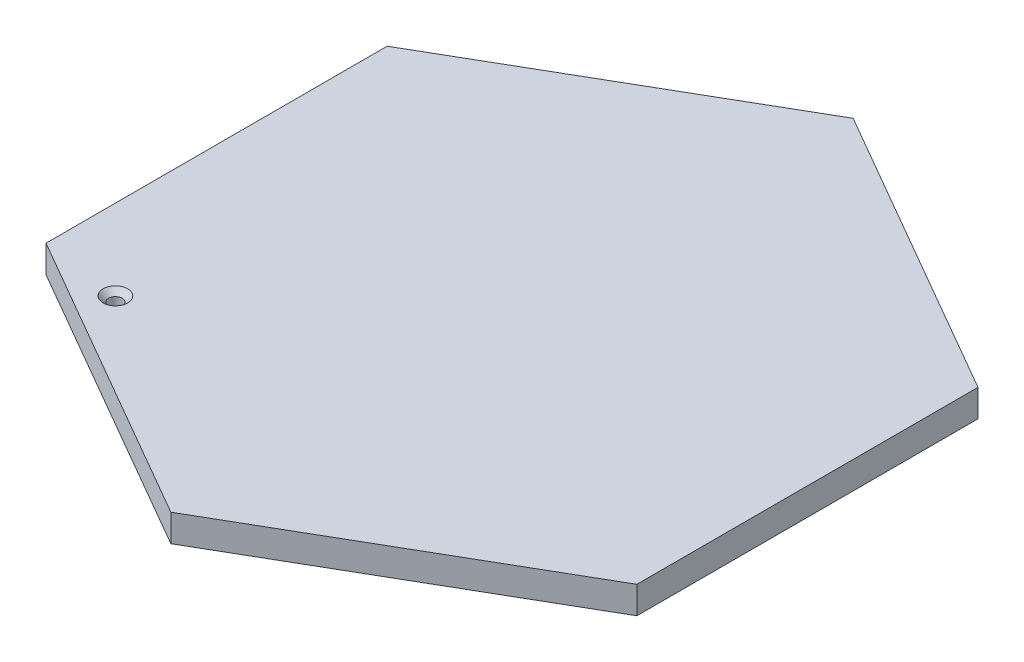
ISO-10303-21;
HEADER;
FILE_DESCRIPTION(('STEP AP214'),'2;1');
FILE_NAME('part.step','',(''),(''),'','','');
FILE_SCHEMA(('AUTOMOTIVE_DESIGN { 1 0 10303 214 1 1 1 1 }'));
ENDSEC;
DATA;
#1=APPLICATION_CONTEXT('core data for automotive mechanical design processes');
#2=APPLICATION_PROTOCOL_DEFINITION('international standard','automotive_design',2000,#1);
#3=PRODUCT_CONTEXT('',#1,'mechanical');
#4=PRODUCT('Part','Part','',(#3));
#5=PRODUCT_RELATED_PRODUCT_CATEGORY('part','',(#4));
#6=PRODUCT_DEFINITION_FORMATION('','',#4);
#7=PRODUCT_DEFINITION_CONTEXT('part definition',#1,'design');
#8=PRODUCT_DEFINITION('design','',#6,#7);
#9=PRODUCT_DEFINITION_SHAPE('','',#8);
#10=(LENGTH_UNIT() NAMED_UNIT(*) SI_UNIT(.MILLI.,.METRE.));
#11=(NAMED_UNIT(*) PLANE_ANGLE_UNIT() SI_UNIT($,.RADIAN.));
#12=(NAMED_UNIT(*) SI_UNIT($,.STERADIAN.) SOLID_ANGLE_UNIT());
#13=UNCERTAINTY_MEASURE_WITH_UNIT(LENGTH_MEASURE(1.E-05),#10,'distance_accuracy_value','');
#14=(GEOMETRIC_REPRESENTATION_CONTEXT(3) GLOBAL_UNCERTAINTY_ASSIGNED_CONTEXT((#13)) GLOBAL_UNIT_ASSIGNED_CONTEXT((#10,
#11,#12)) REPRESENTATION_CONTEXT('',''));
#15=CARTESIAN_POINT('',(0.,0.,0.));
#16=DIRECTION('',(0.,0.,1.));
#17=DIRECTION('',(1.,0.,0.));
#18=AXIS2_PLACEMENT_3D('',#15,#16,#17);
#19=CARTESIAN_POINT('',(43.3012701892219,4.,-25.));
#20=DIRECTION('',(-0.5,0.,0.866025403784439));
#21=DIRECTION('',(0.866025403784439,0.,0.5));
#22=AXIS2_PLACEMENT_3D('',#19,#20,#21);
#23=PLANE('',#22);
#24=DIRECTION('',(-0.866025403784439,0.,-0.5));
#25=VECTOR('',#24,1.);
#26=CARTESIAN_POINT('',(43.3012701892219,0.,-25.));
#27=LINE('',#26,#25);
#28=CARTESIAN_POINT('',(43.3012701892219,0.,-25.));
#29=VERTEX_POINT('',#28);
#30=CARTESIAN_POINT('',(0.,0.,-50.));
#31=VERTEX_POINT('',#30);
#32=EDGE_CURVE('E119',#29,#31,#27,.T.);
#33=ORIENTED_EDGE('',*,*,#32,.T.);
#34=DIRECTION('',(0.,-1.,0.));
#35=VECTOR('',#34,1.);
#36=CARTESIAN_POINT('',(0.,4.,-50.));
#37=LINE('',#36,#35);
#38=CARTESIAN_POINT('',(0.,4.,-50.));
#39=VERTEX_POINT('',#38);
#40=EDGE_CURVE('E11',#39,#31,#37,.T.);
#41=ORIENTED_EDGE('',*,*,#40,.F.);
#42=DIRECTION('',(-0.866025403784439,0.,-0.5));
#43=VECTOR('',#42,1.);
#44=CARTESIAN_POINT('',(43.3012701892219,4.,-25.));
#45=LINE('',#44,#43);
#46=CARTESIAN_POINT('',(43.3012701892219,4.,-25.));
#47=VERTEX_POINT('',#46);
#48=EDGE_CURVE('E130',#47,#39,#45,.T.);
#49=ORIENTED_EDGE('',*,*,#48,.F.);
#50=DIRECTION('',(0.,-1.,0.));
#51=VECTOR('',#50,1.);
#52=CARTESIAN_POINT('',(43.3012701892219,4.,-25.));
#53=LINE('',#52,#51);
#54=EDGE_CURVE('E115',#47,#29,#53,.T.);
#55=ORIENTED_EDGE('',*,*,#54,.T.);
#56=EDGE_LOOP('',(#33,#41,#49,#55));
#57=FACE_BOUND('',#56,.T.);
#58=ADVANCED_FACE('F35',(#57),#23,.F.);
#59=CARTESIAN_POINT('',(0.,4.,-50.));
#60=DIRECTION('',(0.5,0.,0.866025403784439));
#61=DIRECTION('',(0.866025403784439,0.,-0.5));
#62=AXIS2_PLACEMENT_3D('',#59,#60,#61);
#63=PLANE('',#62);
#64=DIRECTION('',(-0.866025403784438,0.,0.5));
#65=VECTOR('',#64,1.);
#66=CARTESIAN_POINT('',(0.,0.,-50.));
#67=LINE('',#66,#65);
#68=CARTESIAN_POINT('',(-43.3012701892219,0.,-25.));
#69=VERTEX_POINT('',#68);
#70=EDGE_CURVE('E122',#31,#69,#67,.T.);
#71=ORIENTED_EDGE('',*,*,#70,.T.);
#72=DIRECTION('',(0.,-1.,0.));
#73=VECTOR('',#72,1.);
#74=CARTESIAN_POINT('',(-43.3012701892219,4.,-25.));
#75=LINE('',#74,#73);
#76=CARTESIAN_POINT('',(-43.3012701892219,4.,-25.));
#77=VERTEX_POINT('',#76);
#78=EDGE_CURVE('E43',#77,#69,#75,.T.);
#79=ORIENTED_EDGE('',*,*,#78,.F.);
#80=DIRECTION('',(-0.866025403784438,0.,0.5));
#81=VECTOR('',#80,1.);
#82=CARTESIAN_POINT('',(0.,4.,-50.));
#83=LINE('',#82,#81);
#84=EDGE_CURVE('E88',#39,#77,#83,.T.);
#85=ORIENTED_EDGE('',*,*,#84,.F.);
#86=ORIENTED_EDGE('',*,*,#40,.T.);
#87=EDGE_LOOP('',(#71,#79,#85,#86));
#88=FACE_BOUND('',#87,.T.);
#89=ADVANCED_FACE('F155',(#88),#63,.F.);
#90=CARTESIAN_POINT('',(-43.3012701892219,4.,-25.));
#91=DIRECTION('',(1.,0.,0.));
#92=DIRECTION('',(0.,0.,-1.));
#93=AXIS2_PLACEMENT_3D('',#90,#91,#92);
#94=PLANE('',#93);
#95=DIRECTION('',(0.,0.,1.));
#96=VECTOR('',#95,1.);
#97=CARTESIAN_POINT('',(-43.3012701892219,0.,-25.));
#98=LINE('',#97,#96);
#99=CARTESIAN_POINT('',(-43.3012701892219,0.,25.));
#100=VERTEX_POINT('',#99);
#101=EDGE_CURVE('E125',#69,#100,#98,.T.);
#102=ORIENTED_EDGE('',*,*,#101,.T.);
#103=DIRECTION('',(0.,-1.,0.));
#104=VECTOR('',#103,1.);
#105=CARTESIAN_POINT('',(-43.3012701892219,4.,25.));
#106=LINE('',#105,#104);
#107=CARTESIAN_POINT('',(-43.3012701892219,4.,25.));
#108=VERTEX_POINT('',#107);
#109=EDGE_CURVE('E110',#108,#100,#106,.T.);
#110=ORIENTED_EDGE('',*,*,#109,.F.);
#111=DIRECTION('',(0.,0.,1.));
#112=VECTOR('',#111,1.);
#113=CARTESIAN_POINT('',(-43.3012701892219,4.,-25.));
#114=LINE('',#113,#112);
#115=EDGE_CURVE('E101',#77,#108,#114,.T.);
#116=ORIENTED_EDGE('',*,*,#115,.F.);
#117=ORIENTED_EDGE('',*,*,#78,.T.);
#118=EDGE_LOOP('',(#102,#110,#116,#117));
#119=FACE_BOUND('',#118,.T.);
#120=ADVANCED_FACE('F136',(#119),#94,.F.);
#121=CARTESIAN_POINT('',(-43.3012701892219,4.,25.));
#122=DIRECTION('',(0.5,0.,-0.866025403784439));
#123=DIRECTION('',(-0.866025403784439,0.,-0.5));
#124=AXIS2_PLACEMENT_3D('',#121,#122,#123);
#125=PLANE('',#124);
#126=DIRECTION('',(0.866025403784439,0.,0.5));
#127=VECTOR('',#126,1.);
#128=CARTESIAN_POINT('',(-43.3012701892219,0.,25.));
#129=LINE('',#128,#127);
#130=CARTESIAN_POINT('',(0.,0.,50.));
#131=VERTEX_POINT('',#130);
#132=EDGE_CURVE('E109',#100,#131,#129,.T.);
#133=ORIENTED_EDGE('',*,*,#132,.T.);
#134=DIRECTION('',(0.,-1.,0.));
#135=VECTOR('',#134,1.);
#136=CARTESIAN_POINT('',(0.,4.,50.));
#137=LINE('',#136,#135);
#138=CARTESIAN_POINT('',(0.,4.,50.));
#139=VERTEX_POINT('',#138);
#140=EDGE_CURVE('E106',#139,#131,#137,.T.);
#141=ORIENTED_EDGE('',*,*,#140,.F.);
#142=DIRECTION('',(0.866025403784439,0.,0.5));
#143=VECTOR('',#142,1.);
#144=CARTESIAN_POINT('',(-43.3012701892219,4.,25.));
#145=LINE('',#144,#143);
#146=EDGE_CURVE('E95',#108,#139,#145,.T.);
#147=ORIENTED_EDGE('',*,*,#146,.F.);
#148=ORIENTED_EDGE('',*,*,#109,.T.);
#149=EDGE_LOOP('',(#133,#141,#147,#148));
#150=FACE_BOUND('',#149,.T.);
#151=ADVANCED_FACE('F107',(#150),#125,.F.);
#152=CARTESIAN_POINT('',(0.,4.,50.));
#153=DIRECTION('',(-0.5,0.,-0.866025403784439));
#154=DIRECTION('',(-0.866025403784439,0.,0.5));
#155=AXIS2_PLACEMENT_3D('',#152,#153,#154);
#156=PLANE('',#155);
#157=DIRECTION('',(0.866025403784439,0.,-0.5));
#158=VECTOR('',#157,1.);
#159=CARTESIAN_POINT('',(0.,0.,50.));
#160=LINE('',#159,#158);
#161=CARTESIAN_POINT('',(43.3012701892219,0.,25.));
#162=VERTEX_POINT('',#161);
#163=EDGE_CURVE('E74',#131,#162,#160,.T.);
#164=ORIENTED_EDGE('',*,*,#163,.T.);
#165=DIRECTION('',(0.,-1.,0.));
#166=VECTOR('',#165,1.);
#167=CARTESIAN_POINT('',(43.3012701892219,4.,25.));
#168=LINE('',#167,#166);
#169=CARTESIAN_POINT('',(43.3012701892219,4.,25.));
#170=VERTEX_POINT('',#169);
#171=EDGE_CURVE('E111',#170,#162,#168,.T.);
#172=ORIENTED_EDGE('',*,*,#171,.F.);
#173=DIRECTION('',(0.866025403784439,0.,-0.5));
#174=VECTOR('',#173,1.);
#175=CARTESIAN_POINT('',(0.,4.,50.));
#176=LINE('',#175,#174);
#177=EDGE_CURVE('E99',#139,#170,#176,.T.);
#178=ORIENTED_EDGE('',*,*,#177,.F.);
#179=ORIENTED_EDGE('',*,*,#140,.T.);
#180=EDGE_LOOP('',(#164,#172,#178,#179));
#181=FACE_BOUND('',#180,.T.);
#182=ADVANCED_FACE('F113',(#181),#156,.F.);
#183=CARTESIAN_POINT('',(43.3012701892219,4.,25.));
#184=DIRECTION('',(-1.,0.,0.));
#185=DIRECTION('',(0.,0.,1.));
#186=AXIS2_PLACEMENT_3D('',#183,#184,#185);
#187=PLANE('',#186);
#188=DIRECTION('',(0.,0.,-1.));
#189=VECTOR('',#188,1.);
#190=CARTESIAN_POINT('',(43.3012701892219,0.,25.));
#191=LINE('',#190,#189);
#192=EDGE_CURVE('E80',#162,#29,#191,.T.);
#193=ORIENTED_EDGE('',*,*,#192,.T.);
#194=ORIENTED_EDGE('',*,*,#54,.F.);
#195=DIRECTION('',(0.,0.,-1.));
#196=VECTOR('',#195,1.);
#197=CARTESIAN_POINT('',(43.3012701892219,4.,25.));
#198=LINE('',#197,#196);
#199=EDGE_CURVE('E51',#170,#47,#198,.T.);
#200=ORIENTED_EDGE('',*,*,#199,.F.);
#201=ORIENTED_EDGE('',*,*,#171,.T.);
#202=EDGE_LOOP('',(#193,#194,#200,#201));
#203=FACE_BOUND('',#202,.T.);
#204=ADVANCED_FACE('F143',(#203),#187,.F.);
#205=CARTESIAN_POINT('',(0.,4.,0.));
#206=DIRECTION('',(0.,1.,0.));
#207=DIRECTION('',(0.,0.,1.));
#208=AXIS2_PLACEMENT_3D('',#205,#206,#207);
#209=PLANE('',#208);
#210=CARTESIAN_POINT('',(-31.5249907475931,4.00000000000001,26.60288568297));
#211=DIRECTION('',(0.,1.,0.));
#212=DIRECTION('',(0.,0.,1.));
#213=AXIS2_PLACEMENT_3D('',#210,#211,#212);
#214=CIRCLE('',#213,1.8);
#215=CARTESIAN_POINT('',(-31.5249907475931,4.00000000000001,28.40288568297));
#216=VERTEX_POINT('',#215);
#217=EDGE_CURVE('E221',#216,#216,#214,.T.);
#218=ORIENTED_EDGE('',*,*,#217,.F.);
#219=EDGE_LOOP('',(#218));
#220=FACE_BOUND('',#219,.T.);
#221=ORIENTED_EDGE('',*,*,#48,.T.);
#222=ORIENTED_EDGE('',*,*,#84,.T.);
#223=ORIENTED_EDGE('',*,*,#115,.T.);
#224=ORIENTED_EDGE('',*,*,#146,.T.);
#225=ORIENTED_EDGE('',*,*,#177,.T.);
#226=ORIENTED_EDGE('',*,*,#199,.T.);
#227=EDGE_LOOP('',(#221,#222,#223,#224,#225,#226));
#228=FACE_BOUND('',#227,.T.);
#229=ADVANCED_FACE('F97',(#220,#228),#209,.T.);
#230=CARTESIAN_POINT('',(0.,0.,0.));
#231=DIRECTION('',(0.,1.,0.));
#232=DIRECTION('',(0.,0.,1.));
#233=AXIS2_PLACEMENT_3D('',#230,#231,#232);
#234=PLANE('',#233);
#235=CARTESIAN_POINT('',(-31.5249907475931,0.,26.60288568297));
#236=DIRECTION('',(0.,1.,0.));
#237=DIRECTION('',(0.,0.,1.));
#238=AXIS2_PLACEMENT_3D('',#235,#236,#237);
#239=CIRCLE('',#238,0.999999999999987);
#240=CARTESIAN_POINT('',(-31.5249907475931,0.,27.60288568297));
#241=VERTEX_POINT('',#240);
#242=EDGE_CURVE('E123',#241,#241,#239,.T.);
#243=ORIENTED_EDGE('',*,*,#242,.T.);
#244=EDGE_LOOP('',(#243));
#245=FACE_BOUND('',#244,.T.);
#246=ORIENTED_EDGE('',*,*,#32,.F.);
#247=ORIENTED_EDGE('',*,*,#192,.F.);
#248=ORIENTED_EDGE('',*,*,#163,.F.);
#249=ORIENTED_EDGE('',*,*,#132,.F.);
#250=ORIENTED_EDGE('',*,*,#101,.F.);
#251=ORIENTED_EDGE('',*,*,#70,.F.);
#252=EDGE_LOOP('',(#246,#247,#248,#249,#250,#251));
#253=FACE_BOUND('',#252,.T.);
#254=ADVANCED_FACE('F139',(#245,#253),#234,.F.);
#255=CARTESIAN_POINT('',(-31.5249907475931,4.,26.60288568297));
#256=DIRECTION('',(0.,1.,0.));
#257=DIRECTION('',(0.,0.,1.));
#258=AXIS2_PLACEMENT_3D('',#255,#256,#257);
#259=CYLINDRICAL_SURFACE('',#258,0.999999999999987);
#260=ORIENTED_EDGE('',*,*,#242,.F.);
#261=EDGE_LOOP('',(#260));
#262=FACE_BOUND('',#261,.T.);
#263=CARTESIAN_POINT('',(-31.5249907475931,3.20000000000001,26.60288568297));
#264=DIRECTION('',(0.,1.,0.));
#265=DIRECTION('',(0.,0.,1.));
#266=AXIS2_PLACEMENT_3D('',#263,#264,#265);
#267=CIRCLE('',#266,0.999999999999987);
#268=CARTESIAN_POINT('',(-31.5249907475931,3.20000000000001,27.60288568297));
#269=VERTEX_POINT('',#268);
#270=EDGE_CURVE('E218',#269,#269,#267,.T.);
#271=ORIENTED_EDGE('',*,*,#270,.T.);
#272=EDGE_LOOP('',(#271));
#273=FACE_BOUND('',#272,.T.);
#274=ADVANCED_FACE('F192',(#262,#273),#259,.F.);
#275=CARTESIAN_POINT('',(-31.5249907475931,4.00000000000001,26.60288568297));
#276=DIRECTION('',(0.,1.,0.));
#277=DIRECTION('',(0.,0.,1.));
#278=AXIS2_PLACEMENT_3D('',#275,#276,#277);
#279=CONICAL_SURFACE('',#278,1.8,0.785398163397458);
#280=ORIENTED_EDGE('',*,*,#270,.F.);
#281=EDGE_LOOP('',(#280));
#282=FACE_BOUND('',#281,.T.);
#283=ORIENTED_EDGE('',*,*,#217,.T.);
#284=EDGE_LOOP('',(#283));
#285=FACE_BOUND('',#284,.T.);
#286=ADVANCED_FACE('F201',(#282,#285),#279,.F.);
#287=CLOSED_SHELL('',(#58,#89,#120,#151,#182,#204,#229,#254,#274,#286));
#288=MANIFOLD_SOLID_BREP('B2',#287);
#289=ADVANCED_BREP_SHAPE_REPRESENTATION('',(#18,#288),#14);
#290=SHAPE_DEFINITION_REPRESENTATION(#9,#289);
ENDSEC;
END-ISO-10303-21;
